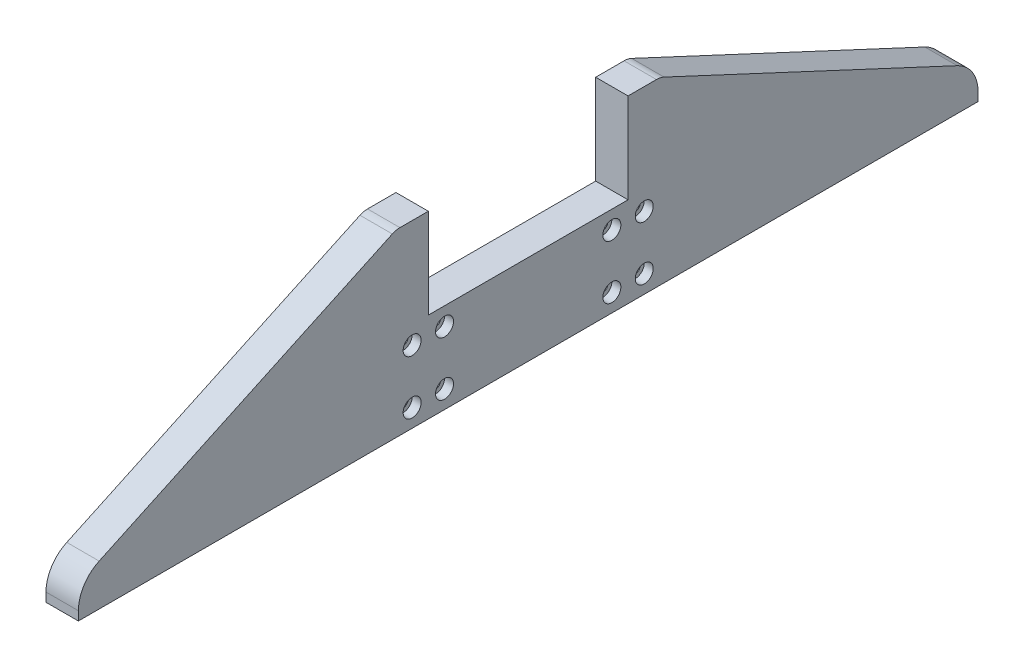
ISO-10303-21;
HEADER;
FILE_DESCRIPTION(('STEP AP214'),'2;1');
FILE_NAME('part.step','',(''),(''),'','','');
FILE_SCHEMA(('AUTOMOTIVE_DESIGN { 1 0 10303 214 1 1 1 1 }'));
ENDSEC;
DATA;
#1=APPLICATION_CONTEXT('core data for automotive mechanical design processes');
#2=APPLICATION_PROTOCOL_DEFINITION('international standard','automotive_design',2000,#1);
#3=PRODUCT_CONTEXT('',#1,'mechanical');
#4=PRODUCT('Part','Part','',(#3));
#5=PRODUCT_RELATED_PRODUCT_CATEGORY('part','',(#4));
#6=PRODUCT_DEFINITION_FORMATION('','',#4);
#7=PRODUCT_DEFINITION_CONTEXT('part definition',#1,'design');
#8=PRODUCT_DEFINITION('design','',#6,#7);
#9=PRODUCT_DEFINITION_SHAPE('','',#8);
#10=(LENGTH_UNIT() NAMED_UNIT(*) SI_UNIT(.MILLI.,.METRE.));
#11=(NAMED_UNIT(*) PLANE_ANGLE_UNIT() SI_UNIT($,.RADIAN.));
#12=(NAMED_UNIT(*) SI_UNIT($,.STERADIAN.) SOLID_ANGLE_UNIT());
#13=UNCERTAINTY_MEASURE_WITH_UNIT(LENGTH_MEASURE(1.E-05),#10,'distance_accuracy_value','');
#14=(GEOMETRIC_REPRESENTATION_CONTEXT(3) GLOBAL_UNCERTAINTY_ASSIGNED_CONTEXT((#13)) GLOBAL_UNIT_ASSIGNED_CONTEXT((#10,
#11,#12)) REPRESENTATION_CONTEXT('',''));
#15=CARTESIAN_POINT('',(0.,0.,0.));
#16=DIRECTION('',(0.,0.,1.));
#17=DIRECTION('',(1.,0.,0.));
#18=AXIS2_PLACEMENT_3D('',#15,#16,#17);
#19=CARTESIAN_POINT('',(18.,0.,500.));
#20=DIRECTION('',(-1.,0.,0.));
#21=DIRECTION('',(0.,-1.,0.));
#22=AXIS2_PLACEMENT_3D('',#19,#20,#21);
#23=PLANE('',#22);
#24=CARTESIAN_POINT('',(18.,40.,185.5));
#25=DIRECTION('',(1.,0.,0.));
#26=DIRECTION('',(0.,0.,-1.));
#27=AXIS2_PLACEMENT_3D('',#24,#25,#26);
#28=CIRCLE('',#27,5.);
#29=CARTESIAN_POINT('',(18.,40.,180.5));
#30=VERTEX_POINT('',#29);
#31=EDGE_CURVE('E678',#30,#30,#28,.T.);
#32=ORIENTED_EDGE('',*,*,#31,.F.);
#33=EDGE_LOOP('',(#32));
#34=FACE_BOUND('',#33,.T.);
#35=CARTESIAN_POINT('',(18.,40.,314.5));
#36=DIRECTION('',(1.,0.,0.));
#37=DIRECTION('',(0.,0.,-1.));
#38=AXIS2_PLACEMENT_3D('',#35,#36,#37);
#39=CIRCLE('',#38,5.);
#40=CARTESIAN_POINT('',(18.,40.,309.5));
#41=VERTEX_POINT('',#40);
#42=EDGE_CURVE('E700',#41,#41,#39,.T.);
#43=ORIENTED_EDGE('',*,*,#42,.F.);
#44=EDGE_LOOP('',(#43));
#45=FACE_BOUND('',#44,.T.);
#46=CARTESIAN_POINT('',(18.,9.99999999999997,314.5));
#47=DIRECTION('',(1.,0.,0.));
#48=DIRECTION('',(0.,0.,-1.));
#49=AXIS2_PLACEMENT_3D('',#46,#47,#48);
#50=CIRCLE('',#49,5.);
#51=CARTESIAN_POINT('',(18.,9.99999999999997,309.5));
#52=VERTEX_POINT('',#51);
#53=EDGE_CURVE('E712',#52,#52,#50,.T.);
#54=ORIENTED_EDGE('',*,*,#53,.F.);
#55=EDGE_LOOP('',(#54));
#56=FACE_BOUND('',#55,.T.);
#57=CARTESIAN_POINT('',(18.,40.,296.5));
#58=DIRECTION('',(1.,0.,0.));
#59=DIRECTION('',(0.,0.,-1.));
#60=AXIS2_PLACEMENT_3D('',#57,#58,#59);
#61=CIRCLE('',#60,5.);
#62=CARTESIAN_POINT('',(18.,40.,291.5));
#63=VERTEX_POINT('',#62);
#64=EDGE_CURVE('E724',#63,#63,#61,.T.);
#65=ORIENTED_EDGE('',*,*,#64,.F.);
#66=EDGE_LOOP('',(#65));
#67=FACE_BOUND('',#66,.T.);
#68=CARTESIAN_POINT('',(18.,9.99999999999999,203.5));
#69=DIRECTION('',(1.,0.,0.));
#70=DIRECTION('',(0.,0.,-1.));
#71=AXIS2_PLACEMENT_3D('',#68,#69,#70);
#72=CIRCLE('',#71,5.);
#73=CARTESIAN_POINT('',(18.,9.99999999999999,198.5));
#74=VERTEX_POINT('',#73);
#75=EDGE_CURVE('E736',#74,#74,#72,.T.);
#76=ORIENTED_EDGE('',*,*,#75,.F.);
#77=EDGE_LOOP('',(#76));
#78=FACE_BOUND('',#77,.T.);
#79=CARTESIAN_POINT('',(18.,9.99999999999999,296.5));
#80=DIRECTION('',(1.,0.,0.));
#81=DIRECTION('',(0.,0.,-1.));
#82=AXIS2_PLACEMENT_3D('',#79,#80,#81);
#83=CIRCLE('',#82,5.);
#84=CARTESIAN_POINT('',(18.,9.99999999999999,291.5));
#85=VERTEX_POINT('',#84);
#86=EDGE_CURVE('E748',#85,#85,#83,.T.);
#87=ORIENTED_EDGE('',*,*,#86,.F.);
#88=EDGE_LOOP('',(#87));
#89=FACE_BOUND('',#88,.T.);
#90=CARTESIAN_POINT('',(18.,40.,203.5));
#91=DIRECTION('',(1.,0.,0.));
#92=DIRECTION('',(0.,0.,-1.));
#93=AXIS2_PLACEMENT_3D('',#90,#91,#92);
#94=CIRCLE('',#93,5.);
#95=CARTESIAN_POINT('',(18.,40.,198.5));
#96=VERTEX_POINT('',#95);
#97=EDGE_CURVE('E760',#96,#96,#94,.T.);
#98=ORIENTED_EDGE('',*,*,#97,.F.);
#99=EDGE_LOOP('',(#98));
#100=FACE_BOUND('',#99,.T.);
#101=DIRECTION('',(0.,0.,-1.));
#102=VECTOR('',#101,1.);
#103=CARTESIAN_POINT('',(18.,100.,500.));
#104=LINE('',#103,#102);
#105=CARTESIAN_POINT('',(18.,100.,321.283053373569));
#106=VERTEX_POINT('',#105);
#107=CARTESIAN_POINT('',(18.,100.,305.5));
#108=VERTEX_POINT('',#107);
#109=EDGE_CURVE('E205',#106,#108,#104,.T.);
#110=ORIENTED_EDGE('',*,*,#109,.F.);
#111=CARTESIAN_POINT('',(18.,90.,321.283053373569));
#112=DIRECTION('',(-1.,0.,0.));
#113=DIRECTION('',(0.,-1.,0.));
#114=AXIS2_PLACEMENT_3D('',#111,#112,#113);
#115=CIRCLE('',#114,10.);
#116=CARTESIAN_POINT('',(18.,99.0630778703665,325.509235990976));
#117=VERTEX_POINT('',#116);
#118=EDGE_CURVE('E248',#106,#117,#115,.F.);
#119=ORIENTED_EDGE('',*,*,#118,.T.);
#120=DIRECTION('',(0.,0.422618261740697,-0.906307787036651));
#121=VECTOR('',#120,1.);
#122=CARTESIAN_POINT('',(18.,17.6966983356427,500.));
#123=LINE('',#122,#121);
#124=CARTESIAN_POINT('',(18.,23.0814488602258,488.452365234814));
#125=VERTEX_POINT('',#124);
#126=EDGE_CURVE('E221',#117,#125,#123,.F.);
#127=ORIENTED_EDGE('',*,*,#126,.T.);
#128=CARTESIAN_POINT('',(18.,4.95529311949279,480.));
#129=DIRECTION('',(-1.,0.,0.));
#130=DIRECTION('',(0.,-1.,0.));
#131=AXIS2_PLACEMENT_3D('',#128,#129,#130);
#132=CIRCLE('',#131,20.);
#133=CARTESIAN_POINT('',(18.,4.95529311949279,500.));
#134=VERTEX_POINT('',#133);
#135=EDGE_CURVE('E235',#125,#134,#132,.F.);
#136=ORIENTED_EDGE('',*,*,#135,.T.);
#137=DIRECTION('',(0.,1.,0.));
#138=VECTOR('',#137,1.);
#139=CARTESIAN_POINT('',(18.,0.,500.));
#140=LINE('',#139,#138);
#141=CARTESIAN_POINT('',(18.,0.,500.));
#142=VERTEX_POINT('',#141);
#143=EDGE_CURVE('E194',#142,#134,#140,.T.);
#144=ORIENTED_EDGE('',*,*,#143,.F.);
#145=DIRECTION('',(0.,0.,-1.));
#146=VECTOR('',#145,1.);
#147=CARTESIAN_POINT('',(18.,0.,500.));
#148=LINE('',#147,#146);
#149=CARTESIAN_POINT('',(18.,0.,0.));
#150=VERTEX_POINT('',#149);
#151=EDGE_CURVE('E207',#142,#150,#148,.T.);
#152=ORIENTED_EDGE('',*,*,#151,.T.);
#153=DIRECTION('',(0.,1.,0.));
#154=VECTOR('',#153,1.);
#155=CARTESIAN_POINT('',(18.,0.,0.));
#156=LINE('',#155,#154);
#157=CARTESIAN_POINT('',(18.,4.95529311949279,0.));
#158=VERTEX_POINT('',#157);
#159=EDGE_CURVE('E192',#150,#158,#156,.T.);
#160=ORIENTED_EDGE('',*,*,#159,.T.);
#161=CARTESIAN_POINT('',(18.,4.95529311949279,20.));
#162=DIRECTION('',(-1.,0.,0.));
#163=DIRECTION('',(0.,-1.,0.));
#164=AXIS2_PLACEMENT_3D('',#161,#162,#163);
#165=CIRCLE('',#164,20.);
#166=CARTESIAN_POINT('',(18.,23.0814488602258,11.547634765186));
#167=VERTEX_POINT('',#166);
#168=EDGE_CURVE('E233',#158,#167,#165,.F.);
#169=ORIENTED_EDGE('',*,*,#168,.T.);
#170=DIRECTION('',(0.,0.422618261740697,0.906307787036651));
#171=VECTOR('',#170,1.);
#172=CARTESIAN_POINT('',(18.,100.,176.500000000001));
#173=LINE('',#172,#171);
#174=CARTESIAN_POINT('',(18.,99.0630778703665,174.490764009024));
#175=VERTEX_POINT('',#174);
#176=EDGE_CURVE('E215',#167,#175,#173,.T.);
#177=ORIENTED_EDGE('',*,*,#176,.T.);
#178=CARTESIAN_POINT('',(18.,90.,178.716946626431));
#179=DIRECTION('',(-1.,0.,0.));
#180=DIRECTION('',(0.,-1.,0.));
#181=AXIS2_PLACEMENT_3D('',#178,#179,#180);
#182=CIRCLE('',#181,10.);
#183=CARTESIAN_POINT('',(18.,100.,178.716946626431));
#184=VERTEX_POINT('',#183);
#185=EDGE_CURVE('E246',#175,#184,#182,.F.);
#186=ORIENTED_EDGE('',*,*,#185,.T.);
#187=CARTESIAN_POINT('',(18.,100.,194.5));
#188=VERTEX_POINT('',#187);
#189=EDGE_CURVE('E169',#188,#184,#104,.T.);
#190=ORIENTED_EDGE('',*,*,#189,.F.);
#191=DIRECTION('',(0.,-1.,0.));
#192=VECTOR('',#191,1.);
#193=CARTESIAN_POINT('',(18.,100.,194.5));
#194=LINE('',#193,#192);
#195=CARTESIAN_POINT('',(18.,50.,194.5));
#196=VERTEX_POINT('',#195);
#197=EDGE_CURVE('E148',#188,#196,#194,.T.);
#198=ORIENTED_EDGE('',*,*,#197,.T.);
#199=DIRECTION('',(0.,0.,1.));
#200=VECTOR('',#199,1.);
#201=CARTESIAN_POINT('',(18.,50.,194.5));
#202=LINE('',#201,#200);
#203=CARTESIAN_POINT('',(18.,50.,305.5));
#204=VERTEX_POINT('',#203);
#205=EDGE_CURVE('E159',#196,#204,#202,.T.);
#206=ORIENTED_EDGE('',*,*,#205,.T.);
#207=DIRECTION('',(0.,1.,0.));
#208=VECTOR('',#207,1.);
#209=CARTESIAN_POINT('',(18.,100.,305.5));
#210=LINE('',#209,#208);
#211=EDGE_CURVE('E156',#204,#108,#210,.T.);
#212=ORIENTED_EDGE('',*,*,#211,.T.);
#213=EDGE_LOOP('',(#110,#119,#127,#136,#144,#152,#160,#169,#177,#186,#190,#198,#206,#212));
#214=FACE_BOUND('',#213,.T.);
#215=CARTESIAN_POINT('',(18.,9.99999999999997,185.5));
#216=DIRECTION('',(1.,0.,0.));
#217=DIRECTION('',(0.,0.,-1.));
#218=AXIS2_PLACEMENT_3D('',#215,#216,#217);
#219=CIRCLE('',#218,5.);
#220=CARTESIAN_POINT('',(18.,9.99999999999997,180.5));
#221=VERTEX_POINT('',#220);
#222=EDGE_CURVE('E688',#221,#221,#219,.T.);
#223=ORIENTED_EDGE('',*,*,#222,.F.);
#224=EDGE_LOOP('',(#223));
#225=FACE_BOUND('',#224,.T.);
#226=ADVANCED_FACE('F45',(#34,#45,#56,#67,#78,#89,#100,#214,#225),#23,.F.);
#227=CARTESIAN_POINT('',(0.,100.,500.));
#228=DIRECTION('',(0.,-1.,0.));
#229=DIRECTION('',(0.,0.,-1.));
#230=AXIS2_PLACEMENT_3D('',#227,#228,#229);
#231=PLANE('',#230);
#232=ORIENTED_EDGE('',*,*,#189,.T.);
#233=DIRECTION('',(-1.,0.,0.));
#234=VECTOR('',#233,1.);
#235=CARTESIAN_POINT('',(0.,100.,178.716946626431));
#236=LINE('',#235,#234);
#237=CARTESIAN_POINT('',(0.,100.,178.716946626431));
#238=VERTEX_POINT('',#237);
#239=EDGE_CURVE('E53',#184,#238,#236,.T.);
#240=ORIENTED_EDGE('',*,*,#239,.T.);
#241=DIRECTION('',(0.,0.,-1.));
#242=VECTOR('',#241,1.);
#243=CARTESIAN_POINT('',(0.,100.,500.));
#244=LINE('',#243,#242);
#245=CARTESIAN_POINT('',(0.,100.,194.5));
#246=VERTEX_POINT('',#245);
#247=EDGE_CURVE('E197',#246,#238,#244,.T.);
#248=ORIENTED_EDGE('',*,*,#247,.F.);
#249=DIRECTION('',(-1.,0.,0.));
#250=VECTOR('',#249,1.);
#251=CARTESIAN_POINT('',(18.,100.,194.5));
#252=LINE('',#251,#250);
#253=EDGE_CURVE('E182',#188,#246,#252,.T.);
#254=ORIENTED_EDGE('',*,*,#253,.F.);
#255=EDGE_LOOP('',(#232,#240,#248,#254));
#256=FACE_BOUND('',#255,.T.);
#257=ADVANCED_FACE('F256',(#256),#231,.F.);
#258=CARTESIAN_POINT('',(0.,0.,500.));
#259=DIRECTION('',(1.,0.,0.));
#260=DIRECTION('',(0.,1.,0.));
#261=AXIS2_PLACEMENT_3D('',#258,#259,#260);
#262=PLANE('',#261);
#263=CARTESIAN_POINT('',(0.,40.,185.5));
#264=DIRECTION('',(1.,0.,0.));
#265=DIRECTION('',(0.,0.,-1.));
#266=AXIS2_PLACEMENT_3D('',#263,#264,#265);
#267=CIRCLE('',#266,2.75);
#268=CARTESIAN_POINT('',(0.,40.,182.75));
#269=VERTEX_POINT('',#268);
#270=EDGE_CURVE('E685',#269,#269,#267,.T.);
#271=ORIENTED_EDGE('',*,*,#270,.T.);
#272=EDGE_LOOP('',(#271));
#273=FACE_BOUND('',#272,.T.);
#274=CARTESIAN_POINT('',(0.,9.99999999999997,185.5));
#275=DIRECTION('',(1.,0.,0.));
#276=DIRECTION('',(0.,0.,-1.));
#277=AXIS2_PLACEMENT_3D('',#274,#275,#276);
#278=CIRCLE('',#277,2.75);
#279=CARTESIAN_POINT('',(0.,9.99999999999997,182.75));
#280=VERTEX_POINT('',#279);
#281=EDGE_CURVE('E697',#280,#280,#278,.T.);
#282=ORIENTED_EDGE('',*,*,#281,.T.);
#283=EDGE_LOOP('',(#282));
#284=FACE_BOUND('',#283,.T.);
#285=CARTESIAN_POINT('',(0.,40.,314.5));
#286=DIRECTION('',(1.,0.,0.));
#287=DIRECTION('',(0.,0.,-1.));
#288=AXIS2_PLACEMENT_3D('',#285,#286,#287);
#289=CIRCLE('',#288,2.75);
#290=CARTESIAN_POINT('',(0.,40.,311.75));
#291=VERTEX_POINT('',#290);
#292=EDGE_CURVE('E709',#291,#291,#289,.T.);
#293=ORIENTED_EDGE('',*,*,#292,.T.);
#294=EDGE_LOOP('',(#293));
#295=FACE_BOUND('',#294,.T.);
#296=CARTESIAN_POINT('',(0.,9.99999999999997,314.5));
#297=DIRECTION('',(1.,0.,0.));
#298=DIRECTION('',(0.,0.,-1.));
#299=AXIS2_PLACEMENT_3D('',#296,#297,#298);
#300=CIRCLE('',#299,2.75);
#301=CARTESIAN_POINT('',(0.,9.99999999999997,311.75));
#302=VERTEX_POINT('',#301);
#303=EDGE_CURVE('E721',#302,#302,#300,.T.);
#304=ORIENTED_EDGE('',*,*,#303,.T.);
#305=EDGE_LOOP('',(#304));
#306=FACE_BOUND('',#305,.T.);
#307=CARTESIAN_POINT('',(0.,40.,296.5));
#308=DIRECTION('',(1.,0.,0.));
#309=DIRECTION('',(0.,0.,-1.));
#310=AXIS2_PLACEMENT_3D('',#307,#308,#309);
#311=CIRCLE('',#310,2.75);
#312=CARTESIAN_POINT('',(0.,40.,293.75));
#313=VERTEX_POINT('',#312);
#314=EDGE_CURVE('E733',#313,#313,#311,.T.);
#315=ORIENTED_EDGE('',*,*,#314,.T.);
#316=EDGE_LOOP('',(#315));
#317=FACE_BOUND('',#316,.T.);
#318=CARTESIAN_POINT('',(0.,9.99999999999999,203.5));
#319=DIRECTION('',(1.,0.,0.));
#320=DIRECTION('',(0.,0.,-1.));
#321=AXIS2_PLACEMENT_3D('',#318,#319,#320);
#322=CIRCLE('',#321,2.75);
#323=CARTESIAN_POINT('',(0.,9.99999999999999,200.75));
#324=VERTEX_POINT('',#323);
#325=EDGE_CURVE('E745',#324,#324,#322,.T.);
#326=ORIENTED_EDGE('',*,*,#325,.T.);
#327=EDGE_LOOP('',(#326));
#328=FACE_BOUND('',#327,.T.);
#329=CARTESIAN_POINT('',(0.,9.99999999999999,296.5));
#330=DIRECTION('',(1.,0.,0.));
#331=DIRECTION('',(0.,0.,-1.));
#332=AXIS2_PLACEMENT_3D('',#329,#330,#331);
#333=CIRCLE('',#332,2.75);
#334=CARTESIAN_POINT('',(0.,9.99999999999999,293.75));
#335=VERTEX_POINT('',#334);
#336=EDGE_CURVE('E757',#335,#335,#333,.T.);
#337=ORIENTED_EDGE('',*,*,#336,.T.);
#338=EDGE_LOOP('',(#337));
#339=FACE_BOUND('',#338,.T.);
#340=CARTESIAN_POINT('',(0.,40.,203.5));
#341=DIRECTION('',(1.,0.,0.));
#342=DIRECTION('',(0.,0.,-1.));
#343=AXIS2_PLACEMENT_3D('',#340,#341,#342);
#344=CIRCLE('',#343,2.75);
#345=CARTESIAN_POINT('',(0.,40.,200.75));
#346=VERTEX_POINT('',#345);
#347=EDGE_CURVE('E176',#346,#346,#344,.T.);
#348=ORIENTED_EDGE('',*,*,#347,.T.);
#349=EDGE_LOOP('',(#348));
#350=FACE_BOUND('',#349,.T.);
#351=DIRECTION('',(0.,-0.422618261740697,0.906307787036651));
#352=VECTOR('',#351,1.);
#353=CARTESIAN_POINT('',(0.,17.6966983356427,500.));
#354=LINE('',#353,#352);
#355=CARTESIAN_POINT('',(0.,23.0814488602258,488.452365234814));
#356=VERTEX_POINT('',#355);
#357=CARTESIAN_POINT('',(0.,99.0630778703665,325.509235990976));
#358=VERTEX_POINT('',#357);
#359=EDGE_CURVE('E218',#356,#358,#354,.F.);
#360=ORIENTED_EDGE('',*,*,#359,.T.);
#361=CARTESIAN_POINT('',(0.,90.,321.283053373569));
#362=DIRECTION('',(1.,0.,0.));
#363=DIRECTION('',(0.,1.,0.));
#364=AXIS2_PLACEMENT_3D('',#361,#362,#363);
#365=CIRCLE('',#364,10.);
#366=CARTESIAN_POINT('',(0.,100.,321.283053373569));
#367=VERTEX_POINT('',#366);
#368=EDGE_CURVE('E253',#358,#367,#365,.F.);
#369=ORIENTED_EDGE('',*,*,#368,.T.);
#370=CARTESIAN_POINT('',(0.,100.,305.5));
#371=VERTEX_POINT('',#370);
#372=EDGE_CURVE('E203',#367,#371,#244,.T.);
#373=ORIENTED_EDGE('',*,*,#372,.T.);
#374=DIRECTION('',(0.,1.,0.));
#375=VECTOR('',#374,1.);
#376=CARTESIAN_POINT('',(0.,100.,305.5));
#377=LINE('',#376,#375);
#378=CARTESIAN_POINT('',(0.,50.,305.5));
#379=VERTEX_POINT('',#378);
#380=EDGE_CURVE('E170',#379,#371,#377,.T.);
#381=ORIENTED_EDGE('',*,*,#380,.F.);
#382=DIRECTION('',(0.,0.,1.));
#383=VECTOR('',#382,1.);
#384=CARTESIAN_POINT('',(0.,50.,194.5));
#385=LINE('',#384,#383);
#386=CARTESIAN_POINT('',(0.,50.,194.5));
#387=VERTEX_POINT('',#386);
#388=EDGE_CURVE('E173',#387,#379,#385,.T.);
#389=ORIENTED_EDGE('',*,*,#388,.F.);
#390=DIRECTION('',(0.,-1.,0.));
#391=VECTOR('',#390,1.);
#392=CARTESIAN_POINT('',(0.,100.,194.5));
#393=LINE('',#392,#391);
#394=EDGE_CURVE('E151',#246,#387,#393,.T.);
#395=ORIENTED_EDGE('',*,*,#394,.F.);
#396=ORIENTED_EDGE('',*,*,#247,.T.);
#397=CARTESIAN_POINT('',(0.,90.,178.716946626431));
#398=DIRECTION('',(1.,0.,0.));
#399=DIRECTION('',(0.,1.,0.));
#400=AXIS2_PLACEMENT_3D('',#397,#398,#399);
#401=CIRCLE('',#400,10.);
#402=CARTESIAN_POINT('',(0.,99.0630778703665,174.490764009024));
#403=VERTEX_POINT('',#402);
#404=EDGE_CURVE('E60',#238,#403,#401,.F.);
#405=ORIENTED_EDGE('',*,*,#404,.T.);
#406=DIRECTION('',(0.,-0.422618261740697,-0.906307787036651));
#407=VECTOR('',#406,1.);
#408=CARTESIAN_POINT('',(0.,100.,176.500000000001));
#409=LINE('',#408,#407);
#410=CARTESIAN_POINT('',(0.,23.0814488602258,11.547634765186));
#411=VERTEX_POINT('',#410);
#412=EDGE_CURVE('E213',#403,#411,#409,.T.);
#413=ORIENTED_EDGE('',*,*,#412,.T.);
#414=CARTESIAN_POINT('',(0.,4.95529311949279,20.));
#415=DIRECTION('',(1.,0.,0.));
#416=DIRECTION('',(0.,1.,0.));
#417=AXIS2_PLACEMENT_3D('',#414,#415,#416);
#418=CIRCLE('',#417,20.);
#419=CARTESIAN_POINT('',(0.,4.95529311949279,0.));
#420=VERTEX_POINT('',#419);
#421=EDGE_CURVE('E226',#411,#420,#418,.F.);
#422=ORIENTED_EDGE('',*,*,#421,.T.);
#423=DIRECTION('',(0.,-1.,0.));
#424=VECTOR('',#423,1.);
#425=CARTESIAN_POINT('',(0.,0.,0.));
#426=LINE('',#425,#424);
#427=CARTESIAN_POINT('',(0.,0.,0.));
#428=VERTEX_POINT('',#427);
#429=EDGE_CURVE('E184',#420,#428,#426,.T.);
#430=ORIENTED_EDGE('',*,*,#429,.T.);
#431=DIRECTION('',(0.,0.,-1.));
#432=VECTOR('',#431,1.);
#433=CARTESIAN_POINT('',(0.,0.,500.));
#434=LINE('',#433,#432);
#435=CARTESIAN_POINT('',(0.,0.,500.));
#436=VERTEX_POINT('',#435);
#437=EDGE_CURVE('E210',#436,#428,#434,.T.);
#438=ORIENTED_EDGE('',*,*,#437,.F.);
#439=DIRECTION('',(0.,-1.,0.));
#440=VECTOR('',#439,1.);
#441=CARTESIAN_POINT('',(0.,0.,500.));
#442=LINE('',#441,#440);
#443=CARTESIAN_POINT('',(0.,4.95529311949279,500.));
#444=VERTEX_POINT('',#443);
#445=EDGE_CURVE('E189',#444,#436,#442,.T.);
#446=ORIENTED_EDGE('',*,*,#445,.F.);
#447=CARTESIAN_POINT('',(0.,4.95529311949279,480.));
#448=DIRECTION('',(1.,0.,0.));
#449=DIRECTION('',(0.,1.,0.));
#450=AXIS2_PLACEMENT_3D('',#447,#448,#449);
#451=CIRCLE('',#450,20.);
#452=EDGE_CURVE('E228',#444,#356,#451,.F.);
#453=ORIENTED_EDGE('',*,*,#452,.T.);
#454=EDGE_LOOP('',(#360,#369,#373,#381,#389,#395,#396,#405,#413,#422,#430,#438,#446,#453));
#455=FACE_BOUND('',#454,.T.);
#456=ADVANCED_FACE('F258',(#273,#284,#295,#306,#317,#328,#339,#350,#455),#262,.F.);
#457=CARTESIAN_POINT('',(0.,0.,500.));
#458=DIRECTION('',(0.,1.,0.));
#459=DIRECTION('',(0.,0.,1.));
#460=AXIS2_PLACEMENT_3D('',#457,#458,#459);
#461=PLANE('',#460);
#462=DIRECTION('',(1.,0.,0.));
#463=VECTOR('',#462,1.);
#464=CARTESIAN_POINT('',(0.,0.,0.));
#465=LINE('',#464,#463);
#466=EDGE_CURVE('E199',#428,#150,#465,.T.);
#467=ORIENTED_EDGE('',*,*,#466,.T.);
#468=ORIENTED_EDGE('',*,*,#151,.F.);
#469=DIRECTION('',(1.,0.,0.));
#470=VECTOR('',#469,1.);
#471=CARTESIAN_POINT('',(0.,0.,500.));
#472=LINE('',#471,#470);
#473=EDGE_CURVE('E191',#436,#142,#472,.T.);
#474=ORIENTED_EDGE('',*,*,#473,.F.);
#475=ORIENTED_EDGE('',*,*,#437,.T.);
#476=EDGE_LOOP('',(#467,#468,#474,#475));
#477=FACE_BOUND('',#476,.T.);
#478=ADVANCED_FACE('F288',(#477),#461,.F.);
#479=ORIENTED_EDGE('',*,*,#372,.F.);
#480=DIRECTION('',(-1.,0.,0.));
#481=VECTOR('',#480,1.);
#482=CARTESIAN_POINT('',(18.,100.,321.283053373569));
#483=LINE('',#482,#481);
#484=EDGE_CURVE('E243',#367,#106,#483,.F.);
#485=ORIENTED_EDGE('',*,*,#484,.T.);
#486=ORIENTED_EDGE('',*,*,#109,.T.);
#487=DIRECTION('',(-1.,0.,0.));
#488=VECTOR('',#487,1.);
#489=CARTESIAN_POINT('',(18.,100.,305.5));
#490=LINE('',#489,#488);
#491=EDGE_CURVE('E185',#108,#371,#490,.T.);
#492=ORIENTED_EDGE('',*,*,#491,.T.);
#493=EDGE_LOOP('',(#479,#485,#486,#492));
#494=FACE_BOUND('',#493,.T.);
#495=ADVANCED_FACE('F265',(#494),#231,.F.);
#496=CARTESIAN_POINT('',(0.,0.,500.));
#497=DIRECTION('',(0.,0.,-1.));
#498=DIRECTION('',(-1.,0.,0.));
#499=AXIS2_PLACEMENT_3D('',#496,#497,#498);
#500=PLANE('',#499);
#501=ORIENTED_EDGE('',*,*,#143,.T.);
#502=DIRECTION('',(1.,0.,0.));
#503=VECTOR('',#502,1.);
#504=CARTESIAN_POINT('',(0.,4.95529311949279,500.));
#505=LINE('',#504,#503);
#506=EDGE_CURVE('E223',#134,#444,#505,.F.);
#507=ORIENTED_EDGE('',*,*,#506,.T.);
#508=ORIENTED_EDGE('',*,*,#445,.T.);
#509=ORIENTED_EDGE('',*,*,#473,.T.);
#510=EDGE_LOOP('',(#501,#507,#508,#509));
#511=FACE_BOUND('',#510,.T.);
#512=ADVANCED_FACE('F283',(#511),#500,.F.);
#513=CARTESIAN_POINT('',(0.,0.,0.));
#514=DIRECTION('',(0.,0.,-1.));
#515=DIRECTION('',(-1.,0.,0.));
#516=AXIS2_PLACEMENT_3D('',#513,#514,#515);
#517=PLANE('',#516);
#518=ORIENTED_EDGE('',*,*,#429,.F.);
#519=DIRECTION('',(1.,0.,0.));
#520=VECTOR('',#519,1.);
#521=CARTESIAN_POINT('',(0.,4.95529311949279,0.));
#522=LINE('',#521,#520);
#523=EDGE_CURVE('E237',#420,#158,#522,.T.);
#524=ORIENTED_EDGE('',*,*,#523,.T.);
#525=ORIENTED_EDGE('',*,*,#159,.F.);
#526=ORIENTED_EDGE('',*,*,#466,.F.);
#527=EDGE_LOOP('',(#518,#524,#525,#526));
#528=FACE_BOUND('',#527,.T.);
#529=ADVANCED_FACE('F293',(#528),#517,.T.);
#530=CARTESIAN_POINT('',(18.,100.,194.5));
#531=DIRECTION('',(0.,0.,-1.));
#532=DIRECTION('',(-1.,0.,0.));
#533=AXIS2_PLACEMENT_3D('',#530,#531,#532);
#534=PLANE('',#533);
#535=ORIENTED_EDGE('',*,*,#394,.T.);
#536=DIRECTION('',(-1.,0.,0.));
#537=VECTOR('',#536,1.);
#538=CARTESIAN_POINT('',(18.,50.,194.5));
#539=LINE('',#538,#537);
#540=EDGE_CURVE('E144',#196,#387,#539,.T.);
#541=ORIENTED_EDGE('',*,*,#540,.F.);
#542=ORIENTED_EDGE('',*,*,#197,.F.);
#543=ORIENTED_EDGE('',*,*,#253,.T.);
#544=EDGE_LOOP('',(#535,#541,#542,#543));
#545=FACE_BOUND('',#544,.T.);
#546=ADVANCED_FACE('F146',(#545),#534,.F.);
#547=CARTESIAN_POINT('',(18.,100.,305.5));
#548=DIRECTION('',(0.,0.,1.));
#549=DIRECTION('',(1.,0.,0.));
#550=AXIS2_PLACEMENT_3D('',#547,#548,#549);
#551=PLANE('',#550);
#552=ORIENTED_EDGE('',*,*,#380,.T.);
#553=ORIENTED_EDGE('',*,*,#491,.F.);
#554=ORIENTED_EDGE('',*,*,#211,.F.);
#555=DIRECTION('',(-1.,0.,0.));
#556=VECTOR('',#555,1.);
#557=CARTESIAN_POINT('',(18.,50.,305.5));
#558=LINE('',#557,#556);
#559=EDGE_CURVE('E155',#204,#379,#558,.T.);
#560=ORIENTED_EDGE('',*,*,#559,.T.);
#561=EDGE_LOOP('',(#552,#553,#554,#560));
#562=FACE_BOUND('',#561,.T.);
#563=ADVANCED_FACE('F263',(#562),#551,.F.);
#564=CARTESIAN_POINT('',(18.,50.,194.5));
#565=DIRECTION('',(0.,-1.,0.));
#566=DIRECTION('',(0.,0.,-1.));
#567=AXIS2_PLACEMENT_3D('',#564,#565,#566);
#568=PLANE('',#567);
#569=ORIENTED_EDGE('',*,*,#388,.T.);
#570=ORIENTED_EDGE('',*,*,#559,.F.);
#571=ORIENTED_EDGE('',*,*,#205,.F.);
#572=ORIENTED_EDGE('',*,*,#540,.T.);
#573=EDGE_LOOP('',(#569,#570,#571,#572));
#574=FACE_BOUND('',#573,.T.);
#575=ADVANCED_FACE('F160',(#574),#568,.F.);
#576=CARTESIAN_POINT('',(18.,40.,203.5));
#577=DIRECTION('',(1.,0.,0.));
#578=DIRECTION('',(0.,0.,-1.));
#579=AXIS2_PLACEMENT_3D('',#576,#577,#578);
#580=CYLINDRICAL_SURFACE('',#579,2.75);
#581=ORIENTED_EDGE('',*,*,#347,.F.);
#582=EDGE_LOOP('',(#581));
#583=FACE_BOUND('',#582,.T.);
#584=CARTESIAN_POINT('',(13.,40.,203.5));
#585=DIRECTION('',(1.,0.,0.));
#586=DIRECTION('',(0.,0.,-1.));
#587=AXIS2_PLACEMENT_3D('',#584,#585,#586);
#588=CIRCLE('',#587,2.75);
#589=CARTESIAN_POINT('',(13.,40.,200.75));
#590=VERTEX_POINT('',#589);
#591=EDGE_CURVE('E765',#590,#590,#588,.T.);
#592=ORIENTED_EDGE('',*,*,#591,.T.);
#593=EDGE_LOOP('',(#592));
#594=FACE_BOUND('',#593,.T.);
#595=ADVANCED_FACE('F390',(#583,#594),#580,.F.);
#596=CARTESIAN_POINT('',(13.,42.75,203.5));
#597=DIRECTION('',(-1.,0.,0.));
#598=DIRECTION('',(0.,0.,1.));
#599=AXIS2_PLACEMENT_3D('',#596,#597,#598);
#600=PLANE('',#599);
#601=ORIENTED_EDGE('',*,*,#591,.F.);
#602=EDGE_LOOP('',(#601));
#603=FACE_BOUND('',#602,.T.);
#604=CARTESIAN_POINT('',(13.,40.,203.5));
#605=DIRECTION('',(1.,0.,0.));
#606=DIRECTION('',(0.,0.,-1.));
#607=AXIS2_PLACEMENT_3D('',#604,#605,#606);
#608=CIRCLE('',#607,5.);
#609=CARTESIAN_POINT('',(13.,40.,198.5));
#610=VERTEX_POINT('',#609);
#611=EDGE_CURVE('E763',#610,#610,#608,.T.);
#612=ORIENTED_EDGE('',*,*,#611,.T.);
#613=EDGE_LOOP('',(#612));
#614=FACE_BOUND('',#613,.T.);
#615=ADVANCED_FACE('F386',(#603,#614),#600,.F.);
#616=CARTESIAN_POINT('',(18.,40.,203.5));
#617=DIRECTION('',(1.,0.,0.));
#618=DIRECTION('',(0.,0.,-1.));
#619=AXIS2_PLACEMENT_3D('',#616,#617,#618);
#620=CYLINDRICAL_SURFACE('',#619,5.);
#621=ORIENTED_EDGE('',*,*,#611,.F.);
#622=EDGE_LOOP('',(#621));
#623=FACE_BOUND('',#622,.T.);
#624=ORIENTED_EDGE('',*,*,#97,.T.);
#625=EDGE_LOOP('',(#624));
#626=FACE_BOUND('',#625,.T.);
#627=ADVANCED_FACE('F382',(#623,#626),#620,.F.);
#628=CARTESIAN_POINT('',(18.,9.99999999999999,296.5));
#629=DIRECTION('',(1.,0.,0.));
#630=DIRECTION('',(0.,0.,-1.));
#631=AXIS2_PLACEMENT_3D('',#628,#629,#630);
#632=CYLINDRICAL_SURFACE('',#631,2.75);
#633=ORIENTED_EDGE('',*,*,#336,.F.);
#634=EDGE_LOOP('',(#633));
#635=FACE_BOUND('',#634,.T.);
#636=CARTESIAN_POINT('',(13.,9.99999999999999,296.5));
#637=DIRECTION('',(1.,0.,0.));
#638=DIRECTION('',(0.,0.,-1.));
#639=AXIS2_PLACEMENT_3D('',#636,#637,#638);
#640=CIRCLE('',#639,2.75);
#641=CARTESIAN_POINT('',(13.,9.99999999999999,293.75));
#642=VERTEX_POINT('',#641);
#643=EDGE_CURVE('E754',#642,#642,#640,.T.);
#644=ORIENTED_EDGE('',*,*,#643,.T.);
#645=EDGE_LOOP('',(#644));
#646=FACE_BOUND('',#645,.T.);
#647=ADVANCED_FACE('F378',(#635,#646),#632,.F.);
#648=CARTESIAN_POINT('',(13.,12.75,296.5));
#649=DIRECTION('',(-1.,0.,0.));
#650=DIRECTION('',(0.,0.,1.));
#651=AXIS2_PLACEMENT_3D('',#648,#649,#650);
#652=PLANE('',#651);
#653=ORIENTED_EDGE('',*,*,#643,.F.);
#654=EDGE_LOOP('',(#653));
#655=FACE_BOUND('',#654,.T.);
#656=CARTESIAN_POINT('',(13.,9.99999999999999,296.5));
#657=DIRECTION('',(1.,0.,0.));
#658=DIRECTION('',(0.,0.,-1.));
#659=AXIS2_PLACEMENT_3D('',#656,#657,#658);
#660=CIRCLE('',#659,5.);
#661=CARTESIAN_POINT('',(13.,9.99999999999999,291.5));
#662=VERTEX_POINT('',#661);
#663=EDGE_CURVE('E751',#662,#662,#660,.T.);
#664=ORIENTED_EDGE('',*,*,#663,.T.);
#665=EDGE_LOOP('',(#664));
#666=FACE_BOUND('',#665,.T.);
#667=ADVANCED_FACE('F374',(#655,#666),#652,.F.);
#668=CARTESIAN_POINT('',(18.,9.99999999999999,296.5));
#669=DIRECTION('',(1.,0.,0.));
#670=DIRECTION('',(0.,0.,-1.));
#671=AXIS2_PLACEMENT_3D('',#668,#669,#670);
#672=CYLINDRICAL_SURFACE('',#671,5.);
#673=ORIENTED_EDGE('',*,*,#663,.F.);
#674=EDGE_LOOP('',(#673));
#675=FACE_BOUND('',#674,.T.);
#676=ORIENTED_EDGE('',*,*,#86,.T.);
#677=EDGE_LOOP('',(#676));
#678=FACE_BOUND('',#677,.T.);
#679=ADVANCED_FACE('F370',(#675,#678),#672,.F.);
#680=CARTESIAN_POINT('',(18.,9.99999999999999,203.5));
#681=DIRECTION('',(1.,0.,0.));
#682=DIRECTION('',(0.,0.,-1.));
#683=AXIS2_PLACEMENT_3D('',#680,#681,#682);
#684=CYLINDRICAL_SURFACE('',#683,2.75);
#685=ORIENTED_EDGE('',*,*,#325,.F.);
#686=EDGE_LOOP('',(#685));
#687=FACE_BOUND('',#686,.T.);
#688=CARTESIAN_POINT('',(13.,9.99999999999999,203.5));
#689=DIRECTION('',(1.,0.,0.));
#690=DIRECTION('',(0.,0.,-1.));
#691=AXIS2_PLACEMENT_3D('',#688,#689,#690);
#692=CIRCLE('',#691,2.75);
#693=CARTESIAN_POINT('',(13.,9.99999999999999,200.75));
#694=VERTEX_POINT('',#693);
#695=EDGE_CURVE('E742',#694,#694,#692,.T.);
#696=ORIENTED_EDGE('',*,*,#695,.T.);
#697=EDGE_LOOP('',(#696));
#698=FACE_BOUND('',#697,.T.);
#699=ADVANCED_FACE('F366',(#687,#698),#684,.F.);
#700=CARTESIAN_POINT('',(13.,12.75,203.5));
#701=DIRECTION('',(-1.,0.,0.));
#702=DIRECTION('',(0.,0.,1.));
#703=AXIS2_PLACEMENT_3D('',#700,#701,#702);
#704=PLANE('',#703);
#705=ORIENTED_EDGE('',*,*,#695,.F.);
#706=EDGE_LOOP('',(#705));
#707=FACE_BOUND('',#706,.T.);
#708=CARTESIAN_POINT('',(13.,9.99999999999999,203.5));
#709=DIRECTION('',(1.,0.,0.));
#710=DIRECTION('',(0.,0.,-1.));
#711=AXIS2_PLACEMENT_3D('',#708,#709,#710);
#712=CIRCLE('',#711,5.);
#713=CARTESIAN_POINT('',(13.,9.99999999999999,198.5));
#714=VERTEX_POINT('',#713);
#715=EDGE_CURVE('E739',#714,#714,#712,.T.);
#716=ORIENTED_EDGE('',*,*,#715,.T.);
#717=EDGE_LOOP('',(#716));
#718=FACE_BOUND('',#717,.T.);
#719=ADVANCED_FACE('F362',(#707,#718),#704,.F.);
#720=CARTESIAN_POINT('',(18.,9.99999999999999,203.5));
#721=DIRECTION('',(1.,0.,0.));
#722=DIRECTION('',(0.,0.,-1.));
#723=AXIS2_PLACEMENT_3D('',#720,#721,#722);
#724=CYLINDRICAL_SURFACE('',#723,5.);
#725=ORIENTED_EDGE('',*,*,#715,.F.);
#726=EDGE_LOOP('',(#725));
#727=FACE_BOUND('',#726,.T.);
#728=ORIENTED_EDGE('',*,*,#75,.T.);
#729=EDGE_LOOP('',(#728));
#730=FACE_BOUND('',#729,.T.);
#731=ADVANCED_FACE('F358',(#727,#730),#724,.F.);
#732=CARTESIAN_POINT('',(18.,40.,296.5));
#733=DIRECTION('',(1.,0.,0.));
#734=DIRECTION('',(0.,0.,-1.));
#735=AXIS2_PLACEMENT_3D('',#732,#733,#734);
#736=CYLINDRICAL_SURFACE('',#735,2.75);
#737=ORIENTED_EDGE('',*,*,#314,.F.);
#738=EDGE_LOOP('',(#737));
#739=FACE_BOUND('',#738,.T.);
#740=CARTESIAN_POINT('',(13.,40.,296.5));
#741=DIRECTION('',(1.,0.,0.));
#742=DIRECTION('',(0.,0.,-1.));
#743=AXIS2_PLACEMENT_3D('',#740,#741,#742);
#744=CIRCLE('',#743,2.75);
#745=CARTESIAN_POINT('',(13.,40.,293.75));
#746=VERTEX_POINT('',#745);
#747=EDGE_CURVE('E730',#746,#746,#744,.T.);
#748=ORIENTED_EDGE('',*,*,#747,.T.);
#749=EDGE_LOOP('',(#748));
#750=FACE_BOUND('',#749,.T.);
#751=ADVANCED_FACE('F354',(#739,#750),#736,.F.);
#752=CARTESIAN_POINT('',(13.,42.75,296.5));
#753=DIRECTION('',(-1.,0.,0.));
#754=DIRECTION('',(0.,0.,1.));
#755=AXIS2_PLACEMENT_3D('',#752,#753,#754);
#756=PLANE('',#755);
#757=ORIENTED_EDGE('',*,*,#747,.F.);
#758=EDGE_LOOP('',(#757));
#759=FACE_BOUND('',#758,.T.);
#760=CARTESIAN_POINT('',(13.,40.,296.5));
#761=DIRECTION('',(1.,0.,0.));
#762=DIRECTION('',(0.,0.,-1.));
#763=AXIS2_PLACEMENT_3D('',#760,#761,#762);
#764=CIRCLE('',#763,5.);
#765=CARTESIAN_POINT('',(13.,40.,291.5));
#766=VERTEX_POINT('',#765);
#767=EDGE_CURVE('E727',#766,#766,#764,.T.);
#768=ORIENTED_EDGE('',*,*,#767,.T.);
#769=EDGE_LOOP('',(#768));
#770=FACE_BOUND('',#769,.T.);
#771=ADVANCED_FACE('F350',(#759,#770),#756,.F.);
#772=CARTESIAN_POINT('',(18.,40.,296.5));
#773=DIRECTION('',(1.,0.,0.));
#774=DIRECTION('',(0.,0.,-1.));
#775=AXIS2_PLACEMENT_3D('',#772,#773,#774);
#776=CYLINDRICAL_SURFACE('',#775,5.);
#777=ORIENTED_EDGE('',*,*,#767,.F.);
#778=EDGE_LOOP('',(#777));
#779=FACE_BOUND('',#778,.T.);
#780=ORIENTED_EDGE('',*,*,#64,.T.);
#781=EDGE_LOOP('',(#780));
#782=FACE_BOUND('',#781,.T.);
#783=ADVANCED_FACE('F325',(#779,#782),#776,.F.);
#784=CARTESIAN_POINT('',(0.,100.,176.500000000001));
#785=DIRECTION('',(0.,0.906307787036651,-0.422618261740697));
#786=DIRECTION('',(1.,0.,0.));
#787=AXIS2_PLACEMENT_3D('',#784,#785,#786);
#788=PLANE('',#787);
#789=ORIENTED_EDGE('',*,*,#412,.F.);
#790=DIRECTION('',(-1.,0.,0.));
#791=VECTOR('',#790,1.);
#792=CARTESIAN_POINT('',(18.,99.0630778703665,174.490764009024));
#793=LINE('',#792,#791);
#794=EDGE_CURVE('E13',#403,#175,#793,.F.);
#795=ORIENTED_EDGE('',*,*,#794,.T.);
#796=ORIENTED_EDGE('',*,*,#176,.F.);
#797=DIRECTION('',(1.,0.,0.));
#798=VECTOR('',#797,1.);
#799=CARTESIAN_POINT('',(0.,23.0814488602258,11.5476347651861));
#800=LINE('',#799,#798);
#801=EDGE_CURVE('E240',#167,#411,#800,.F.);
#802=ORIENTED_EDGE('',*,*,#801,.T.);
#803=EDGE_LOOP('',(#789,#795,#796,#802));
#804=FACE_BOUND('',#803,.T.);
#805=ADVANCED_FACE('F301',(#804),#788,.T.);
#806=CARTESIAN_POINT('',(0.,17.6966983356427,500.));
#807=DIRECTION('',(0.,-0.906307787036651,-0.422618261740697));
#808=DIRECTION('',(-1.,0.,0.));
#809=AXIS2_PLACEMENT_3D('',#806,#807,#808);
#810=PLANE('',#809);
#811=ORIENTED_EDGE('',*,*,#126,.F.);
#812=DIRECTION('',(1.,0.,0.));
#813=VECTOR('',#812,1.);
#814=CARTESIAN_POINT('',(0.,99.0630778703665,325.509235990976));
#815=LINE('',#814,#813);
#816=EDGE_CURVE('E250',#117,#358,#815,.F.);
#817=ORIENTED_EDGE('',*,*,#816,.T.);
#818=ORIENTED_EDGE('',*,*,#359,.F.);
#819=DIRECTION('',(-1.,0.,0.));
#820=VECTOR('',#819,1.);
#821=CARTESIAN_POINT('',(18.,23.0814488602258,488.452365234814));
#822=LINE('',#821,#820);
#823=EDGE_CURVE('E230',#356,#125,#822,.F.);
#824=ORIENTED_EDGE('',*,*,#823,.T.);
#825=EDGE_LOOP('',(#811,#817,#818,#824));
#826=FACE_BOUND('',#825,.T.);
#827=ADVANCED_FACE('F271',(#826),#810,.F.);
#828=CARTESIAN_POINT('',(0.,4.95529311949279,480.));
#829=DIRECTION('',(-1.,0.,0.));
#830=DIRECTION('',(0.,0.,1.));
#831=AXIS2_PLACEMENT_3D('',#828,#829,#830);
#832=CYLINDRICAL_SURFACE('',#831,20.);
#833=ORIENTED_EDGE('',*,*,#135,.F.);
#834=ORIENTED_EDGE('',*,*,#823,.F.);
#835=ORIENTED_EDGE('',*,*,#452,.F.);
#836=ORIENTED_EDGE('',*,*,#506,.F.);
#837=EDGE_LOOP('',(#833,#834,#835,#836));
#838=FACE_BOUND('',#837,.T.);
#839=ADVANCED_FACE('F279',(#838),#832,.T.);
#840=CARTESIAN_POINT('',(0.,4.95529311949279,20.));
#841=DIRECTION('',(1.,0.,0.));
#842=DIRECTION('',(0.,0.,-1.));
#843=AXIS2_PLACEMENT_3D('',#840,#841,#842);
#844=CYLINDRICAL_SURFACE('',#843,20.);
#845=ORIENTED_EDGE('',*,*,#421,.F.);
#846=ORIENTED_EDGE('',*,*,#801,.F.);
#847=ORIENTED_EDGE('',*,*,#168,.F.);
#848=ORIENTED_EDGE('',*,*,#523,.F.);
#849=EDGE_LOOP('',(#845,#846,#847,#848));
#850=FACE_BOUND('',#849,.T.);
#851=ADVANCED_FACE('F297',(#850),#844,.T.);
#852=CARTESIAN_POINT('',(18.,9.99999999999997,314.5));
#853=DIRECTION('',(1.,0.,0.));
#854=DIRECTION('',(0.,0.,-1.));
#855=AXIS2_PLACEMENT_3D('',#852,#853,#854);
#856=CYLINDRICAL_SURFACE('',#855,2.75);
#857=ORIENTED_EDGE('',*,*,#303,.F.);
#858=EDGE_LOOP('',(#857));
#859=FACE_BOUND('',#858,.T.);
#860=CARTESIAN_POINT('',(13.,9.99999999999997,314.5));
#861=DIRECTION('',(1.,0.,0.));
#862=DIRECTION('',(0.,0.,-1.));
#863=AXIS2_PLACEMENT_3D('',#860,#861,#862);
#864=CIRCLE('',#863,2.75);
#865=CARTESIAN_POINT('',(13.,9.99999999999997,311.75));
#866=VERTEX_POINT('',#865);
#867=EDGE_CURVE('E718',#866,#866,#864,.T.);
#868=ORIENTED_EDGE('',*,*,#867,.T.);
#869=EDGE_LOOP('',(#868));
#870=FACE_BOUND('',#869,.T.);
#871=ADVANCED_FACE('F331',(#859,#870),#856,.F.);
#872=CARTESIAN_POINT('',(13.,12.75,314.5));
#873=DIRECTION('',(-1.,0.,0.));
#874=DIRECTION('',(0.,0.,1.));
#875=AXIS2_PLACEMENT_3D('',#872,#873,#874);
#876=PLANE('',#875);
#877=ORIENTED_EDGE('',*,*,#867,.F.);
#878=EDGE_LOOP('',(#877));
#879=FACE_BOUND('',#878,.T.);
#880=CARTESIAN_POINT('',(13.,9.99999999999997,314.5));
#881=DIRECTION('',(1.,0.,0.));
#882=DIRECTION('',(0.,0.,-1.));
#883=AXIS2_PLACEMENT_3D('',#880,#881,#882);
#884=CIRCLE('',#883,5.);
#885=CARTESIAN_POINT('',(13.,9.99999999999997,309.5));
#886=VERTEX_POINT('',#885);
#887=EDGE_CURVE('E715',#886,#886,#884,.T.);
#888=ORIENTED_EDGE('',*,*,#887,.T.);
#889=EDGE_LOOP('',(#888));
#890=FACE_BOUND('',#889,.T.);
#891=ADVANCED_FACE('F335',(#879,#890),#876,.F.);
#892=CARTESIAN_POINT('',(18.,9.99999999999997,314.5));
#893=DIRECTION('',(1.,0.,0.));
#894=DIRECTION('',(0.,0.,-1.));
#895=AXIS2_PLACEMENT_3D('',#892,#893,#894);
#896=CYLINDRICAL_SURFACE('',#895,5.);
#897=ORIENTED_EDGE('',*,*,#887,.F.);
#898=EDGE_LOOP('',(#897));
#899=FACE_BOUND('',#898,.T.);
#900=ORIENTED_EDGE('',*,*,#53,.T.);
#901=EDGE_LOOP('',(#900));
#902=FACE_BOUND('',#901,.T.);
#903=ADVANCED_FACE('F341',(#899,#902),#896,.F.);
#904=CARTESIAN_POINT('',(18.,40.,314.5));
#905=DIRECTION('',(1.,0.,0.));
#906=DIRECTION('',(0.,0.,-1.));
#907=AXIS2_PLACEMENT_3D('',#904,#905,#906);
#908=CYLINDRICAL_SURFACE('',#907,2.75);
#909=ORIENTED_EDGE('',*,*,#292,.F.);
#910=EDGE_LOOP('',(#909));
#911=FACE_BOUND('',#910,.T.);
#912=CARTESIAN_POINT('',(13.,40.,314.5));
#913=DIRECTION('',(1.,0.,0.));
#914=DIRECTION('',(0.,0.,-1.));
#915=AXIS2_PLACEMENT_3D('',#912,#913,#914);
#916=CIRCLE('',#915,2.75);
#917=CARTESIAN_POINT('',(13.,40.,311.75));
#918=VERTEX_POINT('',#917);
#919=EDGE_CURVE('E706',#918,#918,#916,.T.);
#920=ORIENTED_EDGE('',*,*,#919,.T.);
#921=EDGE_LOOP('',(#920));
#922=FACE_BOUND('',#921,.T.);
#923=ADVANCED_FACE('F506',(#911,#922),#908,.F.);
#924=CARTESIAN_POINT('',(13.,42.75,314.5));
#925=DIRECTION('',(-1.,0.,0.));
#926=DIRECTION('',(0.,0.,1.));
#927=AXIS2_PLACEMENT_3D('',#924,#925,#926);
#928=PLANE('',#927);
#929=ORIENTED_EDGE('',*,*,#919,.F.);
#930=EDGE_LOOP('',(#929));
#931=FACE_BOUND('',#930,.T.);
#932=CARTESIAN_POINT('',(13.,40.,314.5));
#933=DIRECTION('',(1.,0.,0.));
#934=DIRECTION('',(0.,0.,-1.));
#935=AXIS2_PLACEMENT_3D('',#932,#933,#934);
#936=CIRCLE('',#935,5.);
#937=CARTESIAN_POINT('',(13.,40.,309.5));
#938=VERTEX_POINT('',#937);
#939=EDGE_CURVE('E703',#938,#938,#936,.T.);
#940=ORIENTED_EDGE('',*,*,#939,.T.);
#941=EDGE_LOOP('',(#940));
#942=FACE_BOUND('',#941,.T.);
#943=ADVANCED_FACE('F515',(#931,#942),#928,.F.);
#944=CARTESIAN_POINT('',(18.,40.,314.5));
#945=DIRECTION('',(1.,0.,0.));
#946=DIRECTION('',(0.,0.,-1.));
#947=AXIS2_PLACEMENT_3D('',#944,#945,#946);
#948=CYLINDRICAL_SURFACE('',#947,5.);
#949=ORIENTED_EDGE('',*,*,#939,.F.);
#950=EDGE_LOOP('',(#949));
#951=FACE_BOUND('',#950,.T.);
#952=ORIENTED_EDGE('',*,*,#42,.T.);
#953=EDGE_LOOP('',(#952));
#954=FACE_BOUND('',#953,.T.);
#955=ADVANCED_FACE('F525',(#951,#954),#948,.F.);
#956=CARTESIAN_POINT('',(18.,9.99999999999997,185.5));
#957=DIRECTION('',(1.,0.,0.));
#958=DIRECTION('',(0.,0.,-1.));
#959=AXIS2_PLACEMENT_3D('',#956,#957,#958);
#960=CYLINDRICAL_SURFACE('',#959,2.75);
#961=ORIENTED_EDGE('',*,*,#281,.F.);
#962=EDGE_LOOP('',(#961));
#963=FACE_BOUND('',#962,.T.);
#964=CARTESIAN_POINT('',(13.,9.99999999999997,185.5));
#965=DIRECTION('',(1.,0.,0.));
#966=DIRECTION('',(0.,0.,-1.));
#967=AXIS2_PLACEMENT_3D('',#964,#965,#966);
#968=CIRCLE('',#967,2.75);
#969=CARTESIAN_POINT('',(13.,9.99999999999997,182.75));
#970=VERTEX_POINT('',#969);
#971=EDGE_CURVE('E694',#970,#970,#968,.T.);
#972=ORIENTED_EDGE('',*,*,#971,.T.);
#973=EDGE_LOOP('',(#972));
#974=FACE_BOUND('',#973,.T.);
#975=ADVANCED_FACE('F535',(#963,#974),#960,.F.);
#976=CARTESIAN_POINT('',(13.,12.75,185.5));
#977=DIRECTION('',(-1.,0.,0.));
#978=DIRECTION('',(0.,0.,1.));
#979=AXIS2_PLACEMENT_3D('',#976,#977,#978);
#980=PLANE('',#979);
#981=ORIENTED_EDGE('',*,*,#971,.F.);
#982=EDGE_LOOP('',(#981));
#983=FACE_BOUND('',#982,.T.);
#984=CARTESIAN_POINT('',(13.,9.99999999999997,185.5));
#985=DIRECTION('',(1.,0.,0.));
#986=DIRECTION('',(0.,0.,-1.));
#987=AXIS2_PLACEMENT_3D('',#984,#985,#986);
#988=CIRCLE('',#987,5.);
#989=CARTESIAN_POINT('',(13.,9.99999999999997,180.5));
#990=VERTEX_POINT('',#989);
#991=EDGE_CURVE('E691',#990,#990,#988,.T.);
#992=ORIENTED_EDGE('',*,*,#991,.T.);
#993=EDGE_LOOP('',(#992));
#994=FACE_BOUND('',#993,.T.);
#995=ADVANCED_FACE('F546',(#983,#994),#980,.F.);
#996=CARTESIAN_POINT('',(18.,9.99999999999997,185.5));
#997=DIRECTION('',(1.,0.,0.));
#998=DIRECTION('',(0.,0.,-1.));
#999=AXIS2_PLACEMENT_3D('',#996,#997,#998);
#1000=CYLINDRICAL_SURFACE('',#999,5.);
#1001=ORIENTED_EDGE('',*,*,#991,.F.);
#1002=EDGE_LOOP('',(#1001));
#1003=FACE_BOUND('',#1002,.T.);
#1004=ORIENTED_EDGE('',*,*,#222,.T.);
#1005=EDGE_LOOP('',(#1004));
#1006=FACE_BOUND('',#1005,.T.);
#1007=ADVANCED_FACE('F556',(#1003,#1006),#1000,.F.);
#1008=CARTESIAN_POINT('',(18.,40.,185.5));
#1009=DIRECTION('',(1.,0.,0.));
#1010=DIRECTION('',(0.,0.,-1.));
#1011=AXIS2_PLACEMENT_3D('',#1008,#1009,#1010);
#1012=CYLINDRICAL_SURFACE('',#1011,2.75);
#1013=ORIENTED_EDGE('',*,*,#270,.F.);
#1014=EDGE_LOOP('',(#1013));
#1015=FACE_BOUND('',#1014,.T.);
#1016=CARTESIAN_POINT('',(13.,40.,185.5));
#1017=DIRECTION('',(1.,0.,0.));
#1018=DIRECTION('',(0.,0.,-1.));
#1019=AXIS2_PLACEMENT_3D('',#1016,#1017,#1018);
#1020=CIRCLE('',#1019,2.75);
#1021=CARTESIAN_POINT('',(13.,40.,182.75));
#1022=VERTEX_POINT('',#1021);
#1023=EDGE_CURVE('E680',#1022,#1022,#1020,.T.);
#1024=ORIENTED_EDGE('',*,*,#1023,.T.);
#1025=EDGE_LOOP('',(#1024));
#1026=FACE_BOUND('',#1025,.T.);
#1027=ADVANCED_FACE('F566',(#1015,#1026),#1012,.F.);
#1028=CARTESIAN_POINT('',(13.,42.75,185.5));
#1029=DIRECTION('',(-1.,0.,0.));
#1030=DIRECTION('',(0.,0.,1.));
#1031=AXIS2_PLACEMENT_3D('',#1028,#1029,#1030);
#1032=PLANE('',#1031);
#1033=ORIENTED_EDGE('',*,*,#1023,.F.);
#1034=EDGE_LOOP('',(#1033));
#1035=FACE_BOUND('',#1034,.T.);
#1036=CARTESIAN_POINT('',(13.,40.,185.5));
#1037=DIRECTION('',(1.,0.,0.));
#1038=DIRECTION('',(0.,0.,-1.));
#1039=AXIS2_PLACEMENT_3D('',#1036,#1037,#1038);
#1040=CIRCLE('',#1039,5.);
#1041=CARTESIAN_POINT('',(13.,40.,180.5));
#1042=VERTEX_POINT('',#1041);
#1043=EDGE_CURVE('E676',#1042,#1042,#1040,.T.);
#1044=ORIENTED_EDGE('',*,*,#1043,.T.);
#1045=EDGE_LOOP('',(#1044));
#1046=FACE_BOUND('',#1045,.T.);
#1047=ADVANCED_FACE('F576',(#1035,#1046),#1032,.F.);
#1048=CARTESIAN_POINT('',(18.,40.,185.5));
#1049=DIRECTION('',(1.,0.,0.));
#1050=DIRECTION('',(0.,0.,-1.));
#1051=AXIS2_PLACEMENT_3D('',#1048,#1049,#1050);
#1052=CYLINDRICAL_SURFACE('',#1051,5.);
#1053=ORIENTED_EDGE('',*,*,#1043,.F.);
#1054=EDGE_LOOP('',(#1053));
#1055=FACE_BOUND('',#1054,.T.);
#1056=ORIENTED_EDGE('',*,*,#31,.T.);
#1057=EDGE_LOOP('',(#1056));
#1058=FACE_BOUND('',#1057,.T.);
#1059=ADVANCED_FACE('F306',(#1055,#1058),#1052,.F.);
#1060=CARTESIAN_POINT('',(0.,90.,321.283053373569));
#1061=DIRECTION('',(1.,0.,0.));
#1062=DIRECTION('',(0.,0.,-1.));
#1063=AXIS2_PLACEMENT_3D('',#1060,#1061,#1062);
#1064=CYLINDRICAL_SURFACE('',#1063,10.);
#1065=ORIENTED_EDGE('',*,*,#368,.F.);
#1066=ORIENTED_EDGE('',*,*,#816,.F.);
#1067=ORIENTED_EDGE('',*,*,#118,.F.);
#1068=ORIENTED_EDGE('',*,*,#484,.F.);
#1069=EDGE_LOOP('',(#1065,#1066,#1067,#1068));
#1070=FACE_BOUND('',#1069,.T.);
#1071=ADVANCED_FACE('F276',(#1070),#1064,.T.);
#1072=CARTESIAN_POINT('',(0.,90.,178.716946626431));
#1073=DIRECTION('',(1.,0.,0.));
#1074=DIRECTION('',(0.,0.,-1.));
#1075=AXIS2_PLACEMENT_3D('',#1072,#1073,#1074);
#1076=CYLINDRICAL_SURFACE('',#1075,10.);
#1077=ORIENTED_EDGE('',*,*,#185,.F.);
#1078=ORIENTED_EDGE('',*,*,#794,.F.);
#1079=ORIENTED_EDGE('',*,*,#404,.F.);
#1080=ORIENTED_EDGE('',*,*,#239,.F.);
#1081=EDGE_LOOP('',(#1077,#1078,#1079,#1080));
#1082=FACE_BOUND('',#1081,.T.);
#1083=ADVANCED_FACE('F47',(#1082),#1076,.T.);
#1084=CLOSED_SHELL('',(#226,#257,#456,#478,#495,#512,#529,#546,#563,#575,#595,#615,#627,#647,
#667,#679,#699,#719,#731,#751,#771,#783,#805,#827,#839,#851,#871,#891,#903,#923,#943,#955,#975,
#995,#1007,#1027,#1047,#1059,#1071,#1083));
#1085=MANIFOLD_SOLID_BREP('B2',#1084);
#1086=ADVANCED_BREP_SHAPE_REPRESENTATION('',(#18,#1085),#14);
#1087=SHAPE_DEFINITION_REPRESENTATION(#9,#1086);
ENDSEC;
END-ISO-10303-21;
